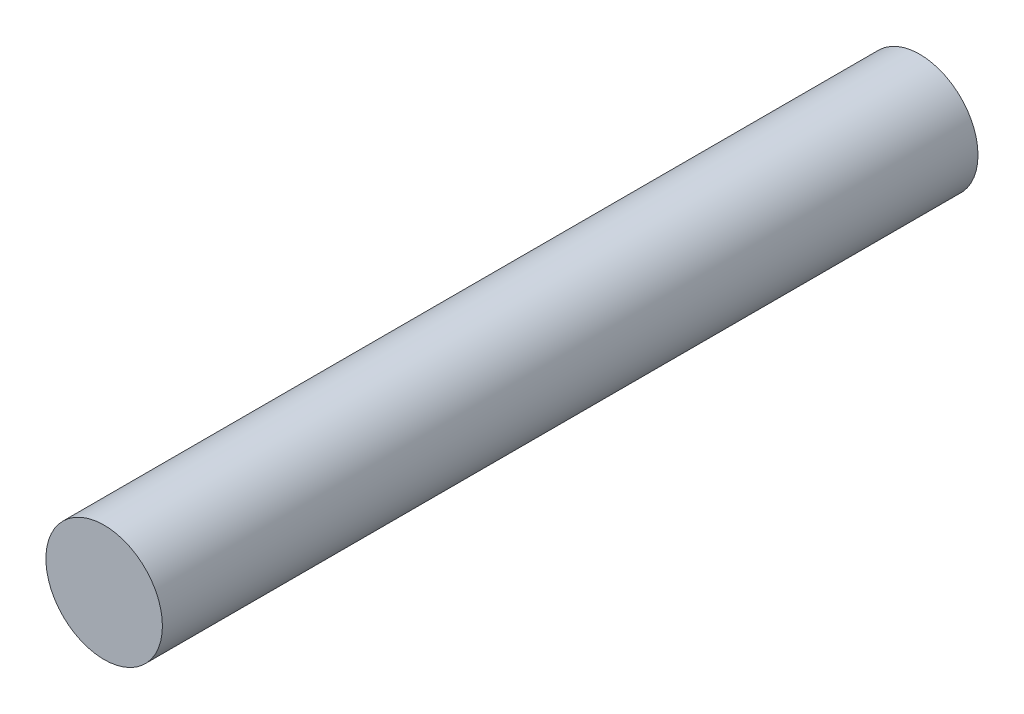
ISO-10303-21;
HEADER;
FILE_DESCRIPTION(('STEP AP214'),'2;1');
FILE_NAME('part.step','',(''),(''),'','','');
FILE_SCHEMA(('AUTOMOTIVE_DESIGN { 1 0 10303 214 1 1 1 1 }'));
ENDSEC;
DATA;
#1=APPLICATION_CONTEXT('core data for automotive mechanical design processes');
#2=APPLICATION_PROTOCOL_DEFINITION('international standard','automotive_design',2000,#1);
#3=PRODUCT_CONTEXT('',#1,'mechanical');
#4=PRODUCT('Part','Part','',(#3));
#5=PRODUCT_RELATED_PRODUCT_CATEGORY('part','',(#4));
#6=PRODUCT_DEFINITION_FORMATION('','',#4);
#7=PRODUCT_DEFINITION_CONTEXT('part definition',#1,'design');
#8=PRODUCT_DEFINITION('design','',#6,#7);
#9=PRODUCT_DEFINITION_SHAPE('','',#8);
#10=(LENGTH_UNIT() NAMED_UNIT(*) SI_UNIT(.MILLI.,.METRE.));
#11=(NAMED_UNIT(*) PLANE_ANGLE_UNIT() SI_UNIT($,.RADIAN.));
#12=(NAMED_UNIT(*) SI_UNIT($,.STERADIAN.) SOLID_ANGLE_UNIT());
#13=UNCERTAINTY_MEASURE_WITH_UNIT(LENGTH_MEASURE(1.E-05),#10,'distance_accuracy_value','');
#14=(GEOMETRIC_REPRESENTATION_CONTEXT(3) GLOBAL_UNCERTAINTY_ASSIGNED_CONTEXT((#13)) GLOBAL_UNIT_ASSIGNED_CONTEXT((#10,
#11,#12)) REPRESENTATION_CONTEXT('',''));
#15=CARTESIAN_POINT('',(0.,0.,0.));
#16=DIRECTION('',(0.,0.,1.));
#17=DIRECTION('',(1.,0.,0.));
#18=AXIS2_PLACEMENT_3D('',#15,#16,#17);
#19=CARTESIAN_POINT('',(0.,0.,22.225));
#20=DIRECTION('',(0.,0.,-1.));
#21=DIRECTION('',(-1.,0.,0.));
#22=AXIS2_PLACEMENT_3D('',#19,#20,#21);
#23=CYLINDRICAL_SURFACE('',#22,3.175);
#24=CARTESIAN_POINT('',(0.,0.,22.225));
#25=DIRECTION('',(0.,0.,1.));
#26=DIRECTION('',(1.,0.,0.));
#27=AXIS2_PLACEMENT_3D('',#24,#25,#26);
#28=CIRCLE('',#27,3.175);
#29=CARTESIAN_POINT('',(3.175,0.,22.225));
#30=VERTEX_POINT('',#29);
#31=EDGE_CURVE('E10',#30,#30,#28,.T.);
#32=ORIENTED_EDGE('',*,*,#31,.F.);
#33=EDGE_LOOP('',(#32));
#34=FACE_BOUND('',#33,.T.);
#35=CARTESIAN_POINT('',(0.,0.,-22.225));
#36=DIRECTION('',(0.,0.,1.));
#37=DIRECTION('',(1.,0.,0.));
#38=AXIS2_PLACEMENT_3D('',#35,#36,#37);
#39=CIRCLE('',#38,3.175);
#40=CARTESIAN_POINT('',(3.175,0.,-22.225));
#41=VERTEX_POINT('',#40);
#42=EDGE_CURVE('E46',#41,#41,#39,.T.);
#43=ORIENTED_EDGE('',*,*,#42,.T.);
#44=EDGE_LOOP('',(#43));
#45=FACE_BOUND('',#44,.T.);
#46=ADVANCED_FACE('F43',(#34,#45),#23,.T.);
#47=CARTESIAN_POINT('',(0.,0.,22.225));
#48=DIRECTION('',(0.,0.,1.));
#49=DIRECTION('',(1.,0.,0.));
#50=AXIS2_PLACEMENT_3D('',#47,#48,#49);
#51=PLANE('',#50);
#52=ORIENTED_EDGE('',*,*,#31,.T.);
#53=EDGE_LOOP('',(#52));
#54=FACE_BOUND('',#53,.T.);
#55=ADVANCED_FACE('F60',(#54),#51,.T.);
#56=CARTESIAN_POINT('',(0.,0.,-22.225));
#57=DIRECTION('',(0.,0.,1.));
#58=DIRECTION('',(1.,0.,0.));
#59=AXIS2_PLACEMENT_3D('',#56,#57,#58);
#60=PLANE('',#59);
#61=ORIENTED_EDGE('',*,*,#42,.F.);
#62=EDGE_LOOP('',(#61));
#63=FACE_BOUND('',#62,.T.);
#64=ADVANCED_FACE('F58',(#63),#60,.F.);
#65=CLOSED_SHELL('',(#46,#55,#64));
#66=MANIFOLD_SOLID_BREP('B2',#65);
#67=ADVANCED_BREP_SHAPE_REPRESENTATION('',(#18,#66),#14);
#68=SHAPE_DEFINITION_REPRESENTATION(#9,#67);
ENDSEC;
END-ISO-10303-21;
